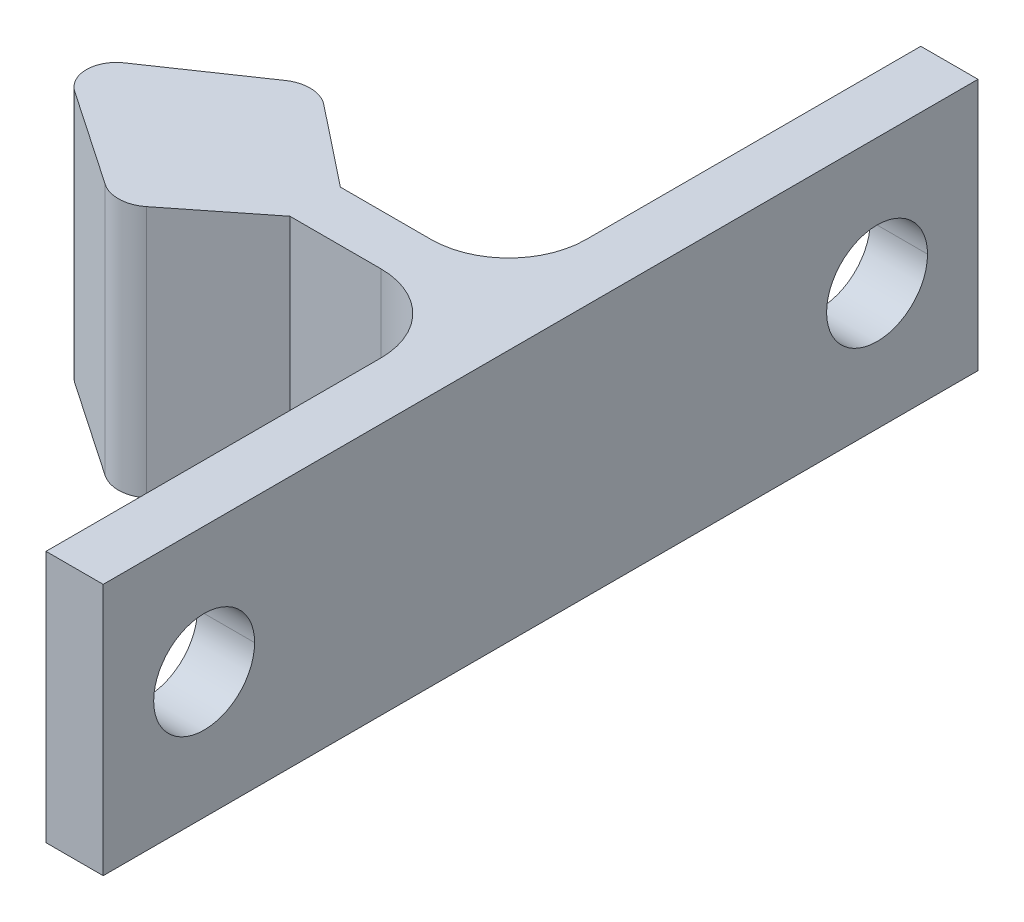
ISO-10303-21;
HEADER;
FILE_DESCRIPTION(('STEP AP214'),'2;1');
FILE_NAME('part.step','',(''),(''),'','','');
FILE_SCHEMA(('AUTOMOTIVE_DESIGN { 1 0 10303 214 1 1 1 1 }'));
ENDSEC;
DATA;
#1=APPLICATION_CONTEXT('core data for automotive mechanical design processes');
#2=APPLICATION_PROTOCOL_DEFINITION('international standard','automotive_design',2000,#1);
#3=PRODUCT_CONTEXT('',#1,'mechanical');
#4=PRODUCT('Part','Part','',(#3));
#5=PRODUCT_RELATED_PRODUCT_CATEGORY('part','',(#4));
#6=PRODUCT_DEFINITION_FORMATION('','',#4);
#7=PRODUCT_DEFINITION_CONTEXT('part definition',#1,'design');
#8=PRODUCT_DEFINITION('design','',#6,#7);
#9=PRODUCT_DEFINITION_SHAPE('','',#8);
#10=(LENGTH_UNIT() NAMED_UNIT(*) SI_UNIT(.MILLI.,.METRE.));
#11=(NAMED_UNIT(*) PLANE_ANGLE_UNIT() SI_UNIT($,.RADIAN.));
#12=(NAMED_UNIT(*) SI_UNIT($,.STERADIAN.) SOLID_ANGLE_UNIT());
#13=UNCERTAINTY_MEASURE_WITH_UNIT(LENGTH_MEASURE(1.E-05),#10,'distance_accuracy_value','');
#14=(GEOMETRIC_REPRESENTATION_CONTEXT(3) GLOBAL_UNCERTAINTY_ASSIGNED_CONTEXT((#13)) GLOBAL_UNIT_ASSIGNED_CONTEXT((#10,
#11,#12)) REPRESENTATION_CONTEXT('',''));
#15=CARTESIAN_POINT('',(0.,0.,0.));
#16=DIRECTION('',(0.,0.,1.));
#17=DIRECTION('',(1.,0.,0.));
#18=AXIS2_PLACEMENT_3D('',#15,#16,#17);
#19=CARTESIAN_POINT('',(0.,-3.75,10.));
#20=DIRECTION('',(-1.,0.,0.));
#21=DIRECTION('',(0.,0.,1.));
#22=AXIS2_PLACEMENT_3D('',#19,#20,#21);
#23=CYLINDRICAL_SURFACE('',#22,1.5);
#24=CARTESIAN_POINT('',(0.,-3.75,10.));
#25=DIRECTION('',(-1.,0.,0.));
#26=DIRECTION('',(0.,0.,1.));
#27=AXIS2_PLACEMENT_3D('',#24,#25,#26);
#28=CIRCLE('',#27,1.5);
#29=CARTESIAN_POINT('',(0.,-3.75,8.5));
#30=VERTEX_POINT('',#29);
#31=CARTESIAN_POINT('',(0.,-3.75,11.5));
#32=VERTEX_POINT('',#31);
#33=EDGE_CURVE('E41',#30,#32,#28,.T.);
#34=ORIENTED_EDGE('',*,*,#33,.F.);
#35=DIRECTION('',(-1.,0.,0.));
#36=VECTOR('',#35,1.);
#37=CARTESIAN_POINT('',(0.,-3.75,8.5));
#38=LINE('',#37,#36);
#39=CARTESIAN_POINT('',(-1.7,-3.75,8.5));
#40=VERTEX_POINT('',#39);
#41=EDGE_CURVE('E11',#30,#40,#38,.T.);
#42=ORIENTED_EDGE('',*,*,#41,.T.);
#43=CARTESIAN_POINT('',(-1.7,-3.75,10.));
#44=DIRECTION('',(1.,0.,0.));
#45=DIRECTION('',(0.,0.,1.));
#46=AXIS2_PLACEMENT_3D('',#43,#44,#45);
#47=CIRCLE('',#46,1.5);
#48=CARTESIAN_POINT('',(-1.7,-3.75,11.5));
#49=VERTEX_POINT('',#48);
#50=EDGE_CURVE('E265',#49,#40,#47,.T.);
#51=ORIENTED_EDGE('',*,*,#50,.F.);
#52=DIRECTION('',(-1.,0.,0.));
#53=VECTOR('',#52,1.);
#54=CARTESIAN_POINT('',(0.,-3.75,11.5));
#55=LINE('',#54,#53);
#56=EDGE_CURVE('E343',#32,#49,#55,.T.);
#57=ORIENTED_EDGE('',*,*,#56,.F.);
#58=EDGE_LOOP('',(#34,#42,#51,#57));
#59=FACE_BOUND('',#58,.T.);
#60=ADVANCED_FACE('F16',(#59),#23,.F.);
#61=CARTESIAN_POINT('',(0.,-3.75,-10.));
#62=DIRECTION('',(-1.,0.,0.));
#63=DIRECTION('',(0.,0.,1.));
#64=AXIS2_PLACEMENT_3D('',#61,#62,#63);
#65=CYLINDRICAL_SURFACE('',#64,1.5);
#66=CARTESIAN_POINT('',(0.,-3.75,-10.));
#67=DIRECTION('',(-1.,0.,0.));
#68=DIRECTION('',(0.,0.,1.));
#69=AXIS2_PLACEMENT_3D('',#66,#67,#68);
#70=CIRCLE('',#69,1.5);
#71=CARTESIAN_POINT('',(0.,-3.75,-11.5));
#72=VERTEX_POINT('',#71);
#73=CARTESIAN_POINT('',(0.,-3.75,-8.5));
#74=VERTEX_POINT('',#73);
#75=EDGE_CURVE('E338',#72,#74,#70,.T.);
#76=ORIENTED_EDGE('',*,*,#75,.F.);
#77=DIRECTION('',(-1.,0.,0.));
#78=VECTOR('',#77,1.);
#79=CARTESIAN_POINT('',(0.,-3.75,-11.5));
#80=LINE('',#79,#78);
#81=CARTESIAN_POINT('',(-1.7,-3.75,-11.5));
#82=VERTEX_POINT('',#81);
#83=EDGE_CURVE('E27',#72,#82,#80,.T.);
#84=ORIENTED_EDGE('',*,*,#83,.T.);
#85=CARTESIAN_POINT('',(-1.7,-3.75,-10.));
#86=DIRECTION('',(1.,0.,0.));
#87=DIRECTION('',(0.,0.,1.));
#88=AXIS2_PLACEMENT_3D('',#85,#86,#87);
#89=CIRCLE('',#88,1.5);
#90=CARTESIAN_POINT('',(-1.7,-3.75,-8.5));
#91=VERTEX_POINT('',#90);
#92=EDGE_CURVE('E278',#91,#82,#89,.T.);
#93=ORIENTED_EDGE('',*,*,#92,.F.);
#94=DIRECTION('',(-1.,0.,0.));
#95=VECTOR('',#94,1.);
#96=CARTESIAN_POINT('',(0.,-3.75,-8.5));
#97=LINE('',#96,#95);
#98=EDGE_CURVE('E364',#74,#91,#97,.T.);
#99=ORIENTED_EDGE('',*,*,#98,.F.);
#100=EDGE_LOOP('',(#76,#84,#93,#99));
#101=FACE_BOUND('',#100,.T.);
#102=ADVANCED_FACE('F716',(#101),#65,.F.);
#103=CARTESIAN_POINT('',(-9.7,-7.5,-1.85));
#104=DIRECTION('',(0.,-1.,0.));
#105=DIRECTION('',(0.,0.,-1.));
#106=AXIS2_PLACEMENT_3D('',#103,#104,#105);
#107=CYLINDRICAL_SURFACE('',#106,1.);
#108=CARTESIAN_POINT('',(-9.7,0.,-1.85));
#109=DIRECTION('',(0.,-1.,0.));
#110=DIRECTION('',(0.,0.,-1.));
#111=AXIS2_PLACEMENT_3D('',#108,#109,#110);
#112=CIRCLE('',#111,1.);
#113=CARTESIAN_POINT('',(-10.2631475258078,0.,-2.6763563784328));
#114=VERTEX_POINT('',#113);
#115=CARTESIAN_POINT('',(-9.7,0.,-2.85));
#116=VERTEX_POINT('',#115);
#117=EDGE_CURVE('E269',#114,#116,#112,.T.);
#118=ORIENTED_EDGE('',*,*,#117,.T.);
#119=DIRECTION('',(0.,-1.,0.));
#120=VECTOR('',#119,1.);
#121=CARTESIAN_POINT('',(-9.7,-7.5,-2.85));
#122=LINE('',#121,#120);
#123=CARTESIAN_POINT('',(-9.7,-7.5,-2.85));
#124=VERTEX_POINT('',#123);
#125=EDGE_CURVE('E346',#116,#124,#122,.T.);
#126=ORIENTED_EDGE('',*,*,#125,.T.);
#127=CARTESIAN_POINT('',(-9.7,-7.5,-1.85));
#128=DIRECTION('',(0.,1.,0.));
#129=DIRECTION('',(0.,0.,-1.));
#130=AXIS2_PLACEMENT_3D('',#127,#128,#129);
#131=CIRCLE('',#130,1.);
#132=CARTESIAN_POINT('',(-10.2631475258078,-7.5,-2.6763563784328));
#133=VERTEX_POINT('',#132);
#134=EDGE_CURVE('E344',#124,#133,#131,.T.);
#135=ORIENTED_EDGE('',*,*,#134,.T.);
#136=DIRECTION('',(0.,-1.,0.));
#137=VECTOR('',#136,1.);
#138=CARTESIAN_POINT('',(-10.2631475258078,-7.5,-2.6763563784328));
#139=LINE('',#138,#137);
#140=EDGE_CURVE('E172',#114,#133,#139,.T.);
#141=ORIENTED_EDGE('',*,*,#140,.F.);
#142=EDGE_LOOP('',(#118,#126,#135,#141));
#143=FACE_BOUND('',#142,.T.);
#144=ADVANCED_FACE('F690',(#143),#107,.T.);
#145=CARTESIAN_POINT('',(0.,-7.5,13.));
#146=DIRECTION('',(1.,0.,0.));
#147=DIRECTION('',(0.,1.,0.));
#148=AXIS2_PLACEMENT_3D('',#145,#146,#147);
#149=PLANE('',#148);
#150=DIRECTION('',(0.,0.,1.));
#151=VECTOR('',#150,1.);
#152=CARTESIAN_POINT('',(0.,0.,13.));
#153=LINE('',#152,#151);
#154=CARTESIAN_POINT('',(0.,0.,-13.));
#155=VERTEX_POINT('',#154);
#156=CARTESIAN_POINT('',(0.,0.,13.));
#157=VERTEX_POINT('',#156);
#158=EDGE_CURVE('E347',#155,#157,#153,.T.);
#159=ORIENTED_EDGE('',*,*,#158,.T.);
#160=DIRECTION('',(0.,-1.,0.));
#161=VECTOR('',#160,1.);
#162=CARTESIAN_POINT('',(0.,-7.5,13.));
#163=LINE('',#162,#161);
#164=CARTESIAN_POINT('',(0.,-7.5,13.));
#165=VERTEX_POINT('',#164);
#166=EDGE_CURVE('E403',#157,#165,#163,.T.);
#167=ORIENTED_EDGE('',*,*,#166,.T.);
#168=DIRECTION('',(0.,0.,-1.));
#169=VECTOR('',#168,1.);
#170=CARTESIAN_POINT('',(0.,-7.5,13.));
#171=LINE('',#170,#169);
#172=CARTESIAN_POINT('',(0.,-7.5,-13.));
#173=VERTEX_POINT('',#172);
#174=EDGE_CURVE('E399',#165,#173,#171,.T.);
#175=ORIENTED_EDGE('',*,*,#174,.T.);
#176=DIRECTION('',(0.,1.,0.));
#177=VECTOR('',#176,1.);
#178=CARTESIAN_POINT('',(0.,-7.5,-13.));
#179=LINE('',#178,#177);
#180=EDGE_CURVE('E375',#173,#155,#179,.T.);
#181=ORIENTED_EDGE('',*,*,#180,.T.);
#182=EDGE_LOOP('',(#159,#167,#175,#181));
#183=FACE_BOUND('',#182,.T.);
#184=CARTESIAN_POINT('',(0.,-3.75,10.));
#185=DIRECTION('',(-1.,0.,0.));
#186=DIRECTION('',(0.,0.,1.));
#187=AXIS2_PLACEMENT_3D('',#184,#185,#186);
#188=CIRCLE('',#187,1.5);
#189=EDGE_CURVE('E371',#32,#30,#188,.T.);
#190=ORIENTED_EDGE('',*,*,#189,.T.);
#191=ORIENTED_EDGE('',*,*,#33,.T.);
#192=EDGE_LOOP('',(#190,#191));
#193=FACE_BOUND('',#192,.T.);
#194=CARTESIAN_POINT('',(0.,-3.75,-10.));
#195=DIRECTION('',(-1.,0.,0.));
#196=DIRECTION('',(0.,0.,1.));
#197=AXIS2_PLACEMENT_3D('',#194,#195,#196);
#198=CIRCLE('',#197,1.5);
#199=EDGE_CURVE('E342',#74,#72,#198,.T.);
#200=ORIENTED_EDGE('',*,*,#199,.T.);
#201=ORIENTED_EDGE('',*,*,#75,.T.);
#202=EDGE_LOOP('',(#200,#201));
#203=FACE_BOUND('',#202,.T.);
#204=ADVANCED_FACE('F686',(#183,#193,#203),#149,.T.);
#205=CARTESIAN_POINT('',(0.,-3.75,10.));
#206=DIRECTION('',(-1.,0.,0.));
#207=DIRECTION('',(0.,0.,1.));
#208=AXIS2_PLACEMENT_3D('',#205,#206,#207);
#209=CYLINDRICAL_SURFACE('',#208,1.5);
#210=ORIENTED_EDGE('',*,*,#41,.F.);
#211=ORIENTED_EDGE('',*,*,#189,.F.);
#212=ORIENTED_EDGE('',*,*,#56,.T.);
#213=CARTESIAN_POINT('',(-1.7,-3.75,10.));
#214=DIRECTION('',(1.,0.,0.));
#215=DIRECTION('',(0.,0.,1.));
#216=AXIS2_PLACEMENT_3D('',#213,#214,#215);
#217=CIRCLE('',#216,1.5);
#218=EDGE_CURVE('E328',#40,#49,#217,.T.);
#219=ORIENTED_EDGE('',*,*,#218,.F.);
#220=EDGE_LOOP('',(#210,#211,#212,#219));
#221=FACE_BOUND('',#220,.T.);
#222=ADVANCED_FACE('F659',(#221),#209,.F.);
#223=CARTESIAN_POINT('',(0.,-3.75,-10.));
#224=DIRECTION('',(-1.,0.,0.));
#225=DIRECTION('',(0.,0.,1.));
#226=AXIS2_PLACEMENT_3D('',#223,#224,#225);
#227=CYLINDRICAL_SURFACE('',#226,1.5);
#228=ORIENTED_EDGE('',*,*,#83,.F.);
#229=ORIENTED_EDGE('',*,*,#199,.F.);
#230=ORIENTED_EDGE('',*,*,#98,.T.);
#231=CARTESIAN_POINT('',(-1.7,-3.75,-10.));
#232=DIRECTION('',(1.,0.,0.));
#233=DIRECTION('',(0.,0.,1.));
#234=AXIS2_PLACEMENT_3D('',#231,#232,#233);
#235=CIRCLE('',#234,1.5);
#236=EDGE_CURVE('E282',#82,#91,#235,.T.);
#237=ORIENTED_EDGE('',*,*,#236,.F.);
#238=EDGE_LOOP('',(#228,#229,#230,#237));
#239=FACE_BOUND('',#238,.T.);
#240=ADVANCED_FACE('F655',(#239),#227,.F.);
#241=CARTESIAN_POINT('',(-1.7,-7.5,13.));
#242=DIRECTION('',(0.,0.,1.));
#243=DIRECTION('',(1.,0.,0.));
#244=AXIS2_PLACEMENT_3D('',#241,#242,#243);
#245=PLANE('',#244);
#246=DIRECTION('',(-1.,0.,0.));
#247=VECTOR('',#246,1.);
#248=CARTESIAN_POINT('',(-1.7,0.,13.));
#249=LINE('',#248,#247);
#250=CARTESIAN_POINT('',(-1.7,0.,13.));
#251=VERTEX_POINT('',#250);
#252=EDGE_CURVE('E361',#157,#251,#249,.T.);
#253=ORIENTED_EDGE('',*,*,#252,.T.);
#254=DIRECTION('',(0.,-1.,0.));
#255=VECTOR('',#254,1.);
#256=CARTESIAN_POINT('',(-1.7,-7.5,13.));
#257=LINE('',#256,#255);
#258=CARTESIAN_POINT('',(-1.7,-7.5,13.));
#259=VERTEX_POINT('',#258);
#260=EDGE_CURVE('E232',#251,#259,#257,.T.);
#261=ORIENTED_EDGE('',*,*,#260,.T.);
#262=DIRECTION('',(1.,0.,0.));
#263=VECTOR('',#262,1.);
#264=CARTESIAN_POINT('',(-1.7,-7.5,13.));
#265=LINE('',#264,#263);
#266=EDGE_CURVE('E353',#259,#165,#265,.T.);
#267=ORIENTED_EDGE('',*,*,#266,.T.);
#268=ORIENTED_EDGE('',*,*,#166,.F.);
#269=EDGE_LOOP('',(#253,#261,#267,#268));
#270=FACE_BOUND('',#269,.T.);
#271=ADVANCED_FACE('F617',(#270),#245,.T.);
#272=CARTESIAN_POINT('',(-12.61,0.,0.));
#273=DIRECTION('',(0.,1.,0.));
#274=DIRECTION('',(1.,0.,0.));
#275=AXIS2_PLACEMENT_3D('',#272,#273,#274);
#276=PLANE('',#275);
#277=CARTESIAN_POINT('',(-4.,0.,-3.05));
#278=DIRECTION('',(0.,-1.,0.));
#279=DIRECTION('',(0.,0.,-1.));
#280=AXIS2_PLACEMENT_3D('',#277,#278,#279);
#281=CIRCLE('',#280,2.3);
#282=CARTESIAN_POINT('',(-1.7,0.,-3.05));
#283=VERTEX_POINT('',#282);
#284=CARTESIAN_POINT('',(-4.,0.,-0.75));
#285=VERTEX_POINT('',#284);
#286=EDGE_CURVE('E274',#283,#285,#281,.T.);
#287=ORIENTED_EDGE('',*,*,#286,.T.);
#288=DIRECTION('',(-1.,0.,0.));
#289=VECTOR('',#288,1.);
#290=CARTESIAN_POINT('',(-12.61,0.,-0.75));
#291=LINE('',#290,#289);
#292=CARTESIAN_POINT('',(-6.7,0.,-0.75));
#293=VERTEX_POINT('',#292);
#294=EDGE_CURVE('E271',#285,#293,#291,.T.);
#295=ORIENTED_EDGE('',*,*,#294,.T.);
#296=DIRECTION('',(-0.783975959186691,0.,-0.62079118503512));
#297=VECTOR('',#296,1.);
#298=CARTESIAN_POINT('',(-6.7,0.,-0.75));
#299=LINE('',#298,#297);
#300=CARTESIAN_POINT('',(-9.07920881496488,0.,-2.63397595918669));
#301=VERTEX_POINT('',#300);
#302=EDGE_CURVE('E203',#293,#301,#299,.T.);
#303=ORIENTED_EDGE('',*,*,#302,.T.);
#304=CARTESIAN_POINT('',(-9.7,0.,-1.85));
#305=DIRECTION('',(0.,-1.,0.));
#306=DIRECTION('',(0.,0.,-1.));
#307=AXIS2_PLACEMENT_3D('',#304,#305,#306);
#308=CIRCLE('',#307,1.);
#309=EDGE_CURVE('E215',#116,#301,#308,.T.);
#310=ORIENTED_EDGE('',*,*,#309,.F.);
#311=ORIENTED_EDGE('',*,*,#117,.F.);
#312=DIRECTION('',(-0.826356378432792,0.,0.563147525807794));
#313=VECTOR('',#312,1.);
#314=CARTESIAN_POINT('',(-10.2631475258078,0.,-2.6763563784328));
#315=LINE('',#314,#313);
#316=CARTESIAN_POINT('',(-13.1112012979689,0.,-0.735457176805187));
#317=VERTEX_POINT('',#316);
#318=EDGE_CURVE('E277',#114,#317,#315,.T.);
#319=ORIENTED_EDGE('',*,*,#318,.T.);
#320=CARTESIAN_POINT('',(-12.61,0.,0.));
#321=DIRECTION('',(0.,1.,0.));
#322=DIRECTION('',(0.,0.,-1.));
#323=AXIS2_PLACEMENT_3D('',#320,#321,#322);
#324=CIRCLE('',#323,0.89);
#325=CARTESIAN_POINT('',(-13.1112012979689,0.,0.735457176805175));
#326=VERTEX_POINT('',#325);
#327=EDGE_CURVE('E423',#317,#326,#324,.T.);
#328=ORIENTED_EDGE('',*,*,#327,.T.);
#329=DIRECTION('',(0.826356378432793,0.,0.563147525807793));
#330=VECTOR('',#329,1.);
#331=CARTESIAN_POINT('',(-13.1112012979689,0.,0.735457176805179));
#332=LINE('',#331,#330);
#333=CARTESIAN_POINT('',(-10.2631475258078,0.,2.67635637843278));
#334=VERTEX_POINT('',#333);
#335=EDGE_CURVE('E292',#326,#334,#332,.T.);
#336=ORIENTED_EDGE('',*,*,#335,.T.);
#337=CARTESIAN_POINT('',(-9.7,0.,1.85));
#338=DIRECTION('',(0.,-1.,0.));
#339=DIRECTION('',(0.,0.,-1.));
#340=AXIS2_PLACEMENT_3D('',#337,#338,#339);
#341=CIRCLE('',#340,1.);
#342=CARTESIAN_POINT('',(-9.07920881496488,0.,2.63397595918669));
#343=VERTEX_POINT('',#342);
#344=EDGE_CURVE('E383',#343,#334,#341,.T.);
#345=ORIENTED_EDGE('',*,*,#344,.F.);
#346=DIRECTION('',(0.783975959186691,0.,-0.62079118503512));
#347=VECTOR('',#346,1.);
#348=CARTESIAN_POINT('',(-9.07920881496488,0.,2.63397595918669));
#349=LINE('',#348,#347);
#350=CARTESIAN_POINT('',(-6.7,0.,0.75));
#351=VERTEX_POINT('',#350);
#352=EDGE_CURVE('E289',#343,#351,#349,.T.);
#353=ORIENTED_EDGE('',*,*,#352,.T.);
#354=DIRECTION('',(1.,0.,0.));
#355=VECTOR('',#354,1.);
#356=CARTESIAN_POINT('',(-12.61,0.,0.75));
#357=LINE('',#356,#355);
#358=CARTESIAN_POINT('',(-4.,0.,0.75));
#359=VERTEX_POINT('',#358);
#360=EDGE_CURVE('E244',#351,#359,#357,.T.);
#361=ORIENTED_EDGE('',*,*,#360,.T.);
#362=CARTESIAN_POINT('',(-4.,0.,3.05));
#363=DIRECTION('',(0.,-1.,0.));
#364=DIRECTION('',(0.,0.,-1.));
#365=AXIS2_PLACEMENT_3D('',#362,#363,#364);
#366=CIRCLE('',#365,2.3);
#367=CARTESIAN_POINT('',(-1.7,0.,3.05));
#368=VERTEX_POINT('',#367);
#369=EDGE_CURVE('E237',#359,#368,#366,.T.);
#370=ORIENTED_EDGE('',*,*,#369,.T.);
#371=DIRECTION('',(0.,0.,1.));
#372=VECTOR('',#371,1.);
#373=CARTESIAN_POINT('',(-1.7,0.,0.));
#374=LINE('',#373,#372);
#375=EDGE_CURVE('E224',#368,#251,#374,.T.);
#376=ORIENTED_EDGE('',*,*,#375,.T.);
#377=ORIENTED_EDGE('',*,*,#252,.F.);
#378=ORIENTED_EDGE('',*,*,#158,.F.);
#379=DIRECTION('',(-1.,0.,0.));
#380=VECTOR('',#379,1.);
#381=CARTESIAN_POINT('',(-12.61,0.,-13.));
#382=LINE('',#381,#380);
#383=CARTESIAN_POINT('',(-1.7,0.,-13.));
#384=VERTEX_POINT('',#383);
#385=EDGE_CURVE('E238',#155,#384,#382,.T.);
#386=ORIENTED_EDGE('',*,*,#385,.T.);
#387=DIRECTION('',(0.,0.,1.));
#388=VECTOR('',#387,1.);
#389=CARTESIAN_POINT('',(-1.7,0.,0.));
#390=LINE('',#389,#388);
#391=EDGE_CURVE('E352',#384,#283,#390,.T.);
#392=ORIENTED_EDGE('',*,*,#391,.T.);
#393=EDGE_LOOP('',(#287,#295,#303,#310,#311,#319,#328,#336,#345,#353,#361,#370,#376,#377,#378,
#386,#392));
#394=FACE_BOUND('',#393,.T.);
#395=ADVANCED_FACE('F242',(#394),#276,.T.);
#396=CARTESIAN_POINT('',(0.,-7.5,-13.));
#397=DIRECTION('',(0.,0.,-1.));
#398=DIRECTION('',(0.,-1.,0.));
#399=AXIS2_PLACEMENT_3D('',#396,#397,#398);
#400=PLANE('',#399);
#401=ORIENTED_EDGE('',*,*,#385,.F.);
#402=ORIENTED_EDGE('',*,*,#180,.F.);
#403=DIRECTION('',(-1.,0.,0.));
#404=VECTOR('',#403,1.);
#405=CARTESIAN_POINT('',(0.,-7.5,-13.));
#406=LINE('',#405,#404);
#407=CARTESIAN_POINT('',(-1.7,-7.5,-13.));
#408=VERTEX_POINT('',#407);
#409=EDGE_CURVE('E264',#173,#408,#406,.T.);
#410=ORIENTED_EDGE('',*,*,#409,.T.);
#411=DIRECTION('',(0.,1.,0.));
#412=VECTOR('',#411,1.);
#413=CARTESIAN_POINT('',(-1.7,-7.5,-13.));
#414=LINE('',#413,#412);
#415=EDGE_CURVE('E256',#408,#384,#414,.T.);
#416=ORIENTED_EDGE('',*,*,#415,.T.);
#417=EDGE_LOOP('',(#401,#402,#410,#416));
#418=FACE_BOUND('',#417,.T.);
#419=ADVANCED_FACE('F616',(#418),#400,.T.);
#420=CARTESIAN_POINT('',(-12.61,-7.5,0.));
#421=DIRECTION('',(0.,1.,0.));
#422=DIRECTION('',(1.,0.,0.));
#423=AXIS2_PLACEMENT_3D('',#420,#421,#422);
#424=PLANE('',#423);
#425=DIRECTION('',(-0.783975959186691,0.,-0.62079118503512));
#426=VECTOR('',#425,1.);
#427=CARTESIAN_POINT('',(-6.7,-7.5,-0.75));
#428=LINE('',#427,#426);
#429=CARTESIAN_POINT('',(-6.7,-7.5,-0.75));
#430=VERTEX_POINT('',#429);
#431=CARTESIAN_POINT('',(-9.07920881496488,-7.5,-2.63397595918669));
#432=VERTEX_POINT('',#431);
#433=EDGE_CURVE('E404',#430,#432,#428,.T.);
#434=ORIENTED_EDGE('',*,*,#433,.F.);
#435=DIRECTION('',(-1.,0.,0.));
#436=VECTOR('',#435,1.);
#437=CARTESIAN_POINT('',(-12.61,-7.5,-0.75));
#438=LINE('',#437,#436);
#439=CARTESIAN_POINT('',(-4.,-7.5,-0.75));
#440=VERTEX_POINT('',#439);
#441=EDGE_CURVE('E297',#440,#430,#438,.T.);
#442=ORIENTED_EDGE('',*,*,#441,.F.);
#443=CARTESIAN_POINT('',(-4.,-7.5,-3.05));
#444=DIRECTION('',(0.,-1.,0.));
#445=DIRECTION('',(0.,0.,-1.));
#446=AXIS2_PLACEMENT_3D('',#443,#444,#445);
#447=CIRCLE('',#446,2.3);
#448=CARTESIAN_POINT('',(-1.7,-7.5,-3.05));
#449=VERTEX_POINT('',#448);
#450=EDGE_CURVE('E298',#449,#440,#447,.T.);
#451=ORIENTED_EDGE('',*,*,#450,.F.);
#452=DIRECTION('',(0.,0.,1.));
#453=VECTOR('',#452,1.);
#454=CARTESIAN_POINT('',(-1.7,-7.5,0.));
#455=LINE('',#454,#453);
#456=EDGE_CURVE('E324',#408,#449,#455,.T.);
#457=ORIENTED_EDGE('',*,*,#456,.F.);
#458=ORIENTED_EDGE('',*,*,#409,.F.);
#459=ORIENTED_EDGE('',*,*,#174,.F.);
#460=ORIENTED_EDGE('',*,*,#266,.F.);
#461=DIRECTION('',(0.,0.,1.));
#462=VECTOR('',#461,1.);
#463=CARTESIAN_POINT('',(-1.7,-7.5,0.));
#464=LINE('',#463,#462);
#465=CARTESIAN_POINT('',(-1.7,-7.5,3.05));
#466=VERTEX_POINT('',#465);
#467=EDGE_CURVE('E257',#466,#259,#464,.T.);
#468=ORIENTED_EDGE('',*,*,#467,.F.);
#469=CARTESIAN_POINT('',(-4.,-7.5,3.05));
#470=DIRECTION('',(0.,-1.,0.));
#471=DIRECTION('',(0.,0.,-1.));
#472=AXIS2_PLACEMENT_3D('',#469,#470,#471);
#473=CIRCLE('',#472,2.3);
#474=CARTESIAN_POINT('',(-4.,-7.5,0.75));
#475=VERTEX_POINT('',#474);
#476=EDGE_CURVE('E253',#475,#466,#473,.T.);
#477=ORIENTED_EDGE('',*,*,#476,.F.);
#478=DIRECTION('',(1.,0.,0.));
#479=VECTOR('',#478,1.);
#480=CARTESIAN_POINT('',(-12.61,-7.5,0.75));
#481=LINE('',#480,#479);
#482=CARTESIAN_POINT('',(-6.7,-7.5,0.75));
#483=VERTEX_POINT('',#482);
#484=EDGE_CURVE('E336',#483,#475,#481,.T.);
#485=ORIENTED_EDGE('',*,*,#484,.F.);
#486=DIRECTION('',(0.783975959186691,0.,-0.62079118503512));
#487=VECTOR('',#486,1.);
#488=CARTESIAN_POINT('',(-9.07920881496488,-7.5,2.63397595918669));
#489=LINE('',#488,#487);
#490=CARTESIAN_POINT('',(-9.07920881496488,-7.5,2.63397595918669));
#491=VERTEX_POINT('',#490);
#492=EDGE_CURVE('E287',#491,#483,#489,.T.);
#493=ORIENTED_EDGE('',*,*,#492,.F.);
#494=CARTESIAN_POINT('',(-9.7,-7.5,1.85));
#495=DIRECTION('',(0.,1.,0.));
#496=DIRECTION('',(0.,0.,-1.));
#497=AXIS2_PLACEMENT_3D('',#494,#495,#496);
#498=CIRCLE('',#497,1.);
#499=CARTESIAN_POINT('',(-10.2631475258078,-7.5,2.67635637843278));
#500=VERTEX_POINT('',#499);
#501=EDGE_CURVE('E330',#500,#491,#498,.T.);
#502=ORIENTED_EDGE('',*,*,#501,.F.);
#503=DIRECTION('',(0.826356378432793,0.,0.563147525807793));
#504=VECTOR('',#503,1.);
#505=CARTESIAN_POINT('',(-13.1112012979689,-7.5,0.735457176805179));
#506=LINE('',#505,#504);
#507=CARTESIAN_POINT('',(-13.1112012979689,-7.5,0.735457176805175));
#508=VERTEX_POINT('',#507);
#509=EDGE_CURVE('E288',#508,#500,#506,.T.);
#510=ORIENTED_EDGE('',*,*,#509,.F.);
#511=CARTESIAN_POINT('',(-12.61,-7.5,0.));
#512=DIRECTION('',(0.,1.,0.));
#513=DIRECTION('',(0.,0.,-1.));
#514=AXIS2_PLACEMENT_3D('',#511,#512,#513);
#515=CIRCLE('',#514,0.89);
#516=CARTESIAN_POINT('',(-13.1112012979689,-7.5,-0.735457176805187));
#517=VERTEX_POINT('',#516);
#518=EDGE_CURVE('E314',#517,#508,#515,.T.);
#519=ORIENTED_EDGE('',*,*,#518,.F.);
#520=DIRECTION('',(-0.826356378432792,0.,0.563147525807794));
#521=VECTOR('',#520,1.);
#522=CARTESIAN_POINT('',(-10.2631475258078,-7.5,-2.6763563784328));
#523=LINE('',#522,#521);
#524=EDGE_CURVE('E370',#133,#517,#523,.T.);
#525=ORIENTED_EDGE('',*,*,#524,.F.);
#526=ORIENTED_EDGE('',*,*,#134,.F.);
#527=CARTESIAN_POINT('',(-9.7,-7.5,-1.85));
#528=DIRECTION('',(0.,1.,0.));
#529=DIRECTION('',(0.,0.,-1.));
#530=AXIS2_PLACEMENT_3D('',#527,#528,#529);
#531=CIRCLE('',#530,1.);
#532=EDGE_CURVE('E331',#432,#124,#531,.T.);
#533=ORIENTED_EDGE('',*,*,#532,.F.);
#534=EDGE_LOOP('',(#434,#442,#451,#457,#458,#459,#460,#468,#477,#485,#493,#502,#510,#519,#525,
#526,#533));
#535=FACE_BOUND('',#534,.T.);
#536=ADVANCED_FACE('F475',(#535),#424,.F.);
#537=CARTESIAN_POINT('',(-1.7,-7.5,3.05));
#538=DIRECTION('',(-1.,0.,0.));
#539=DIRECTION('',(0.,0.,1.));
#540=AXIS2_PLACEMENT_3D('',#537,#538,#539);
#541=PLANE('',#540);
#542=ORIENTED_EDGE('',*,*,#375,.F.);
#543=DIRECTION('',(0.,-1.,0.));
#544=VECTOR('',#543,1.);
#545=CARTESIAN_POINT('',(-1.7,-7.5,3.05));
#546=LINE('',#545,#544);
#547=EDGE_CURVE('E230',#368,#466,#546,.T.);
#548=ORIENTED_EDGE('',*,*,#547,.T.);
#549=ORIENTED_EDGE('',*,*,#467,.T.);
#550=ORIENTED_EDGE('',*,*,#260,.F.);
#551=EDGE_LOOP('',(#542,#548,#549,#550));
#552=FACE_BOUND('',#551,.T.);
#553=ORIENTED_EDGE('',*,*,#50,.T.);
#554=ORIENTED_EDGE('',*,*,#218,.T.);
#555=EDGE_LOOP('',(#553,#554));
#556=FACE_BOUND('',#555,.T.);
#557=ADVANCED_FACE('F226',(#552,#556),#541,.T.);
#558=CARTESIAN_POINT('',(-1.7,-7.5,-13.));
#559=DIRECTION('',(-1.,0.,0.));
#560=DIRECTION('',(0.,0.,1.));
#561=AXIS2_PLACEMENT_3D('',#558,#559,#560);
#562=PLANE('',#561);
#563=ORIENTED_EDGE('',*,*,#391,.F.);
#564=ORIENTED_EDGE('',*,*,#415,.F.);
#565=ORIENTED_EDGE('',*,*,#456,.T.);
#566=DIRECTION('',(0.,1.,0.));
#567=VECTOR('',#566,1.);
#568=CARTESIAN_POINT('',(-1.7,-7.5,-3.05));
#569=LINE('',#568,#567);
#570=EDGE_CURVE('E281',#449,#283,#569,.T.);
#571=ORIENTED_EDGE('',*,*,#570,.T.);
#572=EDGE_LOOP('',(#563,#564,#565,#571));
#573=FACE_BOUND('',#572,.T.);
#574=ORIENTED_EDGE('',*,*,#92,.T.);
#575=ORIENTED_EDGE('',*,*,#236,.T.);
#576=EDGE_LOOP('',(#574,#575));
#577=FACE_BOUND('',#576,.T.);
#578=ADVANCED_FACE('F776',(#573,#577),#562,.T.);
#579=CARTESIAN_POINT('',(-4.,-7.5,-0.75));
#580=DIRECTION('',(0.,0.,-1.));
#581=DIRECTION('',(0.,-1.,0.));
#582=AXIS2_PLACEMENT_3D('',#579,#580,#581);
#583=PLANE('',#582);
#584=ORIENTED_EDGE('',*,*,#294,.F.);
#585=DIRECTION('',(0.,-1.,0.));
#586=VECTOR('',#585,1.);
#587=CARTESIAN_POINT('',(-4.,-7.5,-0.75));
#588=LINE('',#587,#586);
#589=EDGE_CURVE('E389',#285,#440,#588,.T.);
#590=ORIENTED_EDGE('',*,*,#589,.T.);
#591=ORIENTED_EDGE('',*,*,#441,.T.);
#592=DIRECTION('',(0.,1.,0.));
#593=VECTOR('',#592,1.);
#594=CARTESIAN_POINT('',(-6.7,-7.5,-0.75));
#595=LINE('',#594,#593);
#596=EDGE_CURVE('E293',#430,#293,#595,.T.);
#597=ORIENTED_EDGE('',*,*,#596,.T.);
#598=EDGE_LOOP('',(#584,#590,#591,#597));
#599=FACE_BOUND('',#598,.T.);
#600=ADVANCED_FACE('F748',(#599),#583,.T.);
#601=CARTESIAN_POINT('',(-4.,-7.5,-3.05));
#602=DIRECTION('',(0.,-1.,0.));
#603=DIRECTION('',(0.,0.,-1.));
#604=AXIS2_PLACEMENT_3D('',#601,#602,#603);
#605=CYLINDRICAL_SURFACE('',#604,2.3);
#606=ORIENTED_EDGE('',*,*,#450,.T.);
#607=ORIENTED_EDGE('',*,*,#589,.F.);
#608=ORIENTED_EDGE('',*,*,#286,.F.);
#609=ORIENTED_EDGE('',*,*,#570,.F.);
#610=EDGE_LOOP('',(#606,#607,#608,#609));
#611=FACE_BOUND('',#610,.T.);
#612=ADVANCED_FACE('F670',(#611),#605,.F.);
#613=CARTESIAN_POINT('',(-4.,-7.5,3.05));
#614=DIRECTION('',(0.,-1.,0.));
#615=DIRECTION('',(0.,0.,-1.));
#616=AXIS2_PLACEMENT_3D('',#613,#614,#615);
#617=CYLINDRICAL_SURFACE('',#616,2.3);
#618=ORIENTED_EDGE('',*,*,#476,.T.);
#619=ORIENTED_EDGE('',*,*,#547,.F.);
#620=ORIENTED_EDGE('',*,*,#369,.F.);
#621=DIRECTION('',(0.,1.,0.));
#622=VECTOR('',#621,1.);
#623=CARTESIAN_POINT('',(-4.,-7.5,0.75));
#624=LINE('',#623,#622);
#625=EDGE_CURVE('E333',#475,#359,#624,.T.);
#626=ORIENTED_EDGE('',*,*,#625,.F.);
#627=EDGE_LOOP('',(#618,#619,#620,#626));
#628=FACE_BOUND('',#627,.T.);
#629=ADVANCED_FACE('F251',(#628),#617,.F.);
#630=CARTESIAN_POINT('',(-6.7,-7.5,0.75));
#631=DIRECTION('',(0.,0.,1.));
#632=DIRECTION('',(1.,0.,0.));
#633=AXIS2_PLACEMENT_3D('',#630,#631,#632);
#634=PLANE('',#633);
#635=ORIENTED_EDGE('',*,*,#360,.F.);
#636=DIRECTION('',(0.,-1.,0.));
#637=VECTOR('',#636,1.);
#638=CARTESIAN_POINT('',(-6.7,-7.5,0.75));
#639=LINE('',#638,#637);
#640=EDGE_CURVE('E360',#351,#483,#639,.T.);
#641=ORIENTED_EDGE('',*,*,#640,.T.);
#642=ORIENTED_EDGE('',*,*,#484,.T.);
#643=ORIENTED_EDGE('',*,*,#625,.T.);
#644=EDGE_LOOP('',(#635,#641,#642,#643));
#645=FACE_BOUND('',#644,.T.);
#646=ADVANCED_FACE('F18',(#645),#634,.T.);
#647=CARTESIAN_POINT('',(-9.07920881496488,-7.5,2.63397595918669));
#648=DIRECTION('',(0.62079118503512,0.,0.78397595918669));
#649=DIRECTION('',(0.,-1.,0.));
#650=AXIS2_PLACEMENT_3D('',#647,#648,#649);
#651=PLANE('',#650);
#652=ORIENTED_EDGE('',*,*,#352,.F.);
#653=DIRECTION('',(0.,-1.,0.));
#654=VECTOR('',#653,1.);
#655=CARTESIAN_POINT('',(-9.07920881496488,-7.5,2.63397595918669));
#656=LINE('',#655,#654);
#657=EDGE_CURVE('E337',#343,#491,#656,.T.);
#658=ORIENTED_EDGE('',*,*,#657,.T.);
#659=ORIENTED_EDGE('',*,*,#492,.T.);
#660=ORIENTED_EDGE('',*,*,#640,.F.);
#661=EDGE_LOOP('',(#652,#658,#659,#660));
#662=FACE_BOUND('',#661,.T.);
#663=ADVANCED_FACE('F480',(#662),#651,.T.);
#664=CARTESIAN_POINT('',(-13.1112012979689,-7.5,0.735457176805188));
#665=DIRECTION('',(-0.56314752580779,0.,0.826356378432795));
#666=DIRECTION('',(0.,1.,0.));
#667=AXIS2_PLACEMENT_3D('',#664,#665,#666);
#668=PLANE('',#667);
#669=ORIENTED_EDGE('',*,*,#335,.F.);
#670=DIRECTION('',(0.,-1.,0.));
#671=VECTOR('',#670,1.);
#672=CARTESIAN_POINT('',(-13.1112012979689,-7.5,0.735457176805179));
#673=LINE('',#672,#671);
#674=EDGE_CURVE('E283',#326,#508,#673,.T.);
#675=ORIENTED_EDGE('',*,*,#674,.T.);
#676=ORIENTED_EDGE('',*,*,#509,.T.);
#677=DIRECTION('',(0.,1.,0.));
#678=VECTOR('',#677,1.);
#679=CARTESIAN_POINT('',(-10.2631475258078,-7.5,2.67635637843277));
#680=LINE('',#679,#678);
#681=EDGE_CURVE('E302',#500,#334,#680,.T.);
#682=ORIENTED_EDGE('',*,*,#681,.T.);
#683=EDGE_LOOP('',(#669,#675,#676,#682));
#684=FACE_BOUND('',#683,.T.);
#685=ADVANCED_FACE('F482',(#684),#668,.T.);
#686=CARTESIAN_POINT('',(-12.61,-7.5,0.));
#687=DIRECTION('',(0.,-1.,0.));
#688=DIRECTION('',(0.,0.,-1.));
#689=AXIS2_PLACEMENT_3D('',#686,#687,#688);
#690=CYLINDRICAL_SURFACE('',#689,0.89);
#691=ORIENTED_EDGE('',*,*,#327,.F.);
#692=DIRECTION('',(0.,-1.,0.));
#693=VECTOR('',#692,1.);
#694=CARTESIAN_POINT('',(-13.1112012979689,-7.5,-0.735457176805193));
#695=LINE('',#694,#693);
#696=EDGE_CURVE('E305',#317,#517,#695,.T.);
#697=ORIENTED_EDGE('',*,*,#696,.T.);
#698=ORIENTED_EDGE('',*,*,#518,.T.);
#699=ORIENTED_EDGE('',*,*,#674,.F.);
#700=EDGE_LOOP('',(#691,#697,#698,#699));
#701=FACE_BOUND('',#700,.T.);
#702=ADVANCED_FACE('F483',(#701),#690,.T.);
#703=CARTESIAN_POINT('',(-10.2631475258078,-7.5,-2.6763563784328));
#704=DIRECTION('',(-0.56314752580779,0.,-0.826356378432795));
#705=DIRECTION('',(-0.826356378432795,0.,0.56314752580779));
#706=AXIS2_PLACEMENT_3D('',#703,#704,#705);
#707=PLANE('',#706);
#708=ORIENTED_EDGE('',*,*,#318,.F.);
#709=ORIENTED_EDGE('',*,*,#140,.T.);
#710=ORIENTED_EDGE('',*,*,#524,.T.);
#711=ORIENTED_EDGE('',*,*,#696,.F.);
#712=EDGE_LOOP('',(#708,#709,#710,#711));
#713=FACE_BOUND('',#712,.T.);
#714=ADVANCED_FACE('F486',(#713),#707,.T.);
#715=CARTESIAN_POINT('',(-6.7,-7.5,-0.75));
#716=DIRECTION('',(0.62079118503512,0.,-0.78397595918669));
#717=DIRECTION('',(0.,-1.,0.));
#718=AXIS2_PLACEMENT_3D('',#715,#716,#717);
#719=PLANE('',#718);
#720=ORIENTED_EDGE('',*,*,#302,.F.);
#721=ORIENTED_EDGE('',*,*,#596,.F.);
#722=ORIENTED_EDGE('',*,*,#433,.T.);
#723=DIRECTION('',(0.,1.,0.));
#724=VECTOR('',#723,1.);
#725=CARTESIAN_POINT('',(-9.07920881496488,-7.5,-2.63397595918669));
#726=LINE('',#725,#724);
#727=EDGE_CURVE('E20',#432,#301,#726,.T.);
#728=ORIENTED_EDGE('',*,*,#727,.T.);
#729=EDGE_LOOP('',(#720,#721,#722,#728));
#730=FACE_BOUND('',#729,.T.);
#731=ADVANCED_FACE('F629',(#730),#719,.T.);
#732=CARTESIAN_POINT('',(-9.7,-7.5,1.85));
#733=DIRECTION('',(0.,-1.,0.));
#734=DIRECTION('',(0.,0.,-1.));
#735=AXIS2_PLACEMENT_3D('',#732,#733,#734);
#736=CYLINDRICAL_SURFACE('',#735,1.);
#737=ORIENTED_EDGE('',*,*,#344,.T.);
#738=ORIENTED_EDGE('',*,*,#681,.F.);
#739=ORIENTED_EDGE('',*,*,#501,.T.);
#740=ORIENTED_EDGE('',*,*,#657,.F.);
#741=EDGE_LOOP('',(#737,#738,#739,#740));
#742=FACE_BOUND('',#741,.T.);
#743=ADVANCED_FACE('F471',(#742),#736,.T.);
#744=CARTESIAN_POINT('',(-9.7,-7.5,-1.85));
#745=DIRECTION('',(0.,-1.,0.));
#746=DIRECTION('',(0.,0.,-1.));
#747=AXIS2_PLACEMENT_3D('',#744,#745,#746);
#748=CYLINDRICAL_SURFACE('',#747,1.);
#749=ORIENTED_EDGE('',*,*,#125,.F.);
#750=ORIENTED_EDGE('',*,*,#309,.T.);
#751=ORIENTED_EDGE('',*,*,#727,.F.);
#752=ORIENTED_EDGE('',*,*,#532,.T.);
#753=EDGE_LOOP('',(#749,#750,#751,#752));
#754=FACE_BOUND('',#753,.T.);
#755=ADVANCED_FACE('F628',(#754),#748,.T.);
#756=CLOSED_SHELL('',(#60,#102,#144,#204,#222,#240,#271,#395,#419,#536,#557,#578,#600,#612,#629,
#646,#663,#685,#702,#714,#731,#743,#755));
#757=MANIFOLD_SOLID_BREP('B1',#756);
#758=ADVANCED_BREP_SHAPE_REPRESENTATION('',(#18,#757),#14);
#759=SHAPE_DEFINITION_REPRESENTATION(#9,#758);
ENDSEC;
END-ISO-10303-21;
